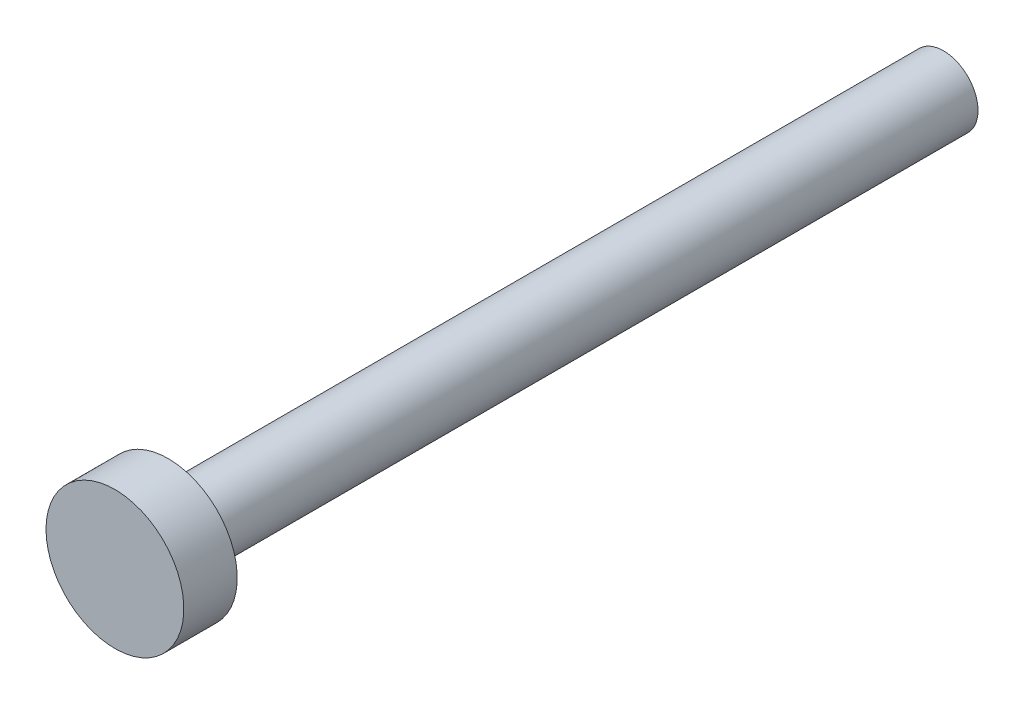
ISO-10303-21;
HEADER;
FILE_DESCRIPTION(('STEP AP214'),'2;1');
FILE_NAME('part.step','',(''),(''),'','','');
FILE_SCHEMA(('AUTOMOTIVE_DESIGN { 1 0 10303 214 1 1 1 1 }'));
ENDSEC;
DATA;
#1=APPLICATION_CONTEXT('core data for automotive mechanical design processes');
#2=APPLICATION_PROTOCOL_DEFINITION('international standard','automotive_design',2000,#1);
#3=PRODUCT_CONTEXT('',#1,'mechanical');
#4=PRODUCT('Part','Part','',(#3));
#5=PRODUCT_RELATED_PRODUCT_CATEGORY('part','',(#4));
#6=PRODUCT_DEFINITION_FORMATION('','',#4);
#7=PRODUCT_DEFINITION_CONTEXT('part definition',#1,'design');
#8=PRODUCT_DEFINITION('design','',#6,#7);
#9=PRODUCT_DEFINITION_SHAPE('','',#8);
#10=(LENGTH_UNIT() NAMED_UNIT(*) SI_UNIT(.MILLI.,.METRE.));
#11=(NAMED_UNIT(*) PLANE_ANGLE_UNIT() SI_UNIT($,.RADIAN.));
#12=(NAMED_UNIT(*) SI_UNIT($,.STERADIAN.) SOLID_ANGLE_UNIT());
#13=UNCERTAINTY_MEASURE_WITH_UNIT(LENGTH_MEASURE(1.E-05),#10,'distance_accuracy_value','');
#14=(GEOMETRIC_REPRESENTATION_CONTEXT(3) GLOBAL_UNCERTAINTY_ASSIGNED_CONTEXT((#13)) GLOBAL_UNIT_ASSIGNED_CONTEXT((#10,
#11,#12)) REPRESENTATION_CONTEXT('',''));
#15=CARTESIAN_POINT('',(0.,0.,0.));
#16=DIRECTION('',(0.,0.,1.));
#17=DIRECTION('',(1.,0.,0.));
#18=AXIS2_PLACEMENT_3D('',#15,#16,#17);
#19=CARTESIAN_POINT('',(0.,0.,3.1));
#20=DIRECTION('',(0.,0.,-1.));
#21=DIRECTION('',(-1.,0.,0.));
#22=AXIS2_PLACEMENT_3D('',#19,#20,#21);
#23=CYLINDRICAL_SURFACE('',#22,4.);
#24=CARTESIAN_POINT('',(0.,0.,3.1));
#25=DIRECTION('',(0.,0.,1.));
#26=DIRECTION('',(1.,0.,0.));
#27=AXIS2_PLACEMENT_3D('',#24,#25,#26);
#28=CIRCLE('',#27,4.);
#29=CARTESIAN_POINT('',(-4.,0.,3.1));
#30=VERTEX_POINT('',#29);
#31=EDGE_CURVE('E40',#30,#30,#28,.T.);
#32=CARTESIAN_POINT('',(0.,0.,0.));
#33=DIRECTION('',(0.,0.,1.));
#34=DIRECTION('',(1.,0.,0.));
#35=AXIS2_PLACEMENT_3D('',#32,#33,#34);
#36=CIRCLE('',#35,4.);
#37=CARTESIAN_POINT('',(-4.,0.,0.));
#38=VERTEX_POINT('',#37);
#39=EDGE_CURVE('E36',#38,#38,#36,.T.);
#40=CARTESIAN_POINT('',(-4.,0.,3.1));
#41=CARTESIAN_POINT('',(-4.,0.,3.06770833333333));
#42=CARTESIAN_POINT('',(-4.,0.,3.03541666666667));
#43=CARTESIAN_POINT('',(-4.,0.,2.97083333333333));
#44=CARTESIAN_POINT('',(-4.,0.,2.93854166666667));
#45=CARTESIAN_POINT('',(-4.,0.,2.87395833333333));
#46=CARTESIAN_POINT('',(-4.,0.,2.84166666666667));
#47=CARTESIAN_POINT('',(-4.,0.,2.77708333333333));
#48=CARTESIAN_POINT('',(-4.,0.,2.74479166666667));
#49=CARTESIAN_POINT('',(-4.,0.,2.68020833333333));
#50=CARTESIAN_POINT('',(-4.,0.,2.64791666666667));
#51=CARTESIAN_POINT('',(-4.,0.,2.58333333333333));
#52=CARTESIAN_POINT('',(-4.,0.,2.55104166666667));
#53=CARTESIAN_POINT('',(-4.,0.,2.48645833333333));
#54=CARTESIAN_POINT('',(-4.,0.,2.45416666666667));
#55=CARTESIAN_POINT('',(-4.,0.,2.38958333333333));
#56=CARTESIAN_POINT('',(-4.,0.,2.35729166666667));
#57=CARTESIAN_POINT('',(-4.,0.,2.29270833333333));
#58=CARTESIAN_POINT('',(-4.,0.,2.26041666666667));
#59=CARTESIAN_POINT('',(-4.,0.,2.19583333333333));
#60=CARTESIAN_POINT('',(-4.,0.,2.16354166666667));
#61=CARTESIAN_POINT('',(-4.,0.,2.09895833333333));
#62=CARTESIAN_POINT('',(-4.,0.,2.06666666666667));
#63=CARTESIAN_POINT('',(-4.,0.,2.00208333333333));
#64=CARTESIAN_POINT('',(-4.,0.,1.96979166666667));
#65=CARTESIAN_POINT('',(-4.,0.,1.90520833333333));
#66=CARTESIAN_POINT('',(-4.,0.,1.87291666666667));
#67=CARTESIAN_POINT('',(-4.,0.,1.80833333333333));
#68=CARTESIAN_POINT('',(-4.,0.,1.77604166666667));
#69=CARTESIAN_POINT('',(-4.,0.,1.71145833333333));
#70=CARTESIAN_POINT('',(-4.,0.,1.67916666666667));
#71=CARTESIAN_POINT('',(-4.,0.,1.61458333333333));
#72=CARTESIAN_POINT('',(-4.,0.,1.58229166666667));
#73=CARTESIAN_POINT('',(-4.,0.,1.51770833333333));
#74=CARTESIAN_POINT('',(-4.,0.,1.48541666666667));
#75=CARTESIAN_POINT('',(-4.,0.,1.42083333333333));
#76=CARTESIAN_POINT('',(-4.,0.,1.38854166666667));
#77=CARTESIAN_POINT('',(-4.,0.,1.32395833333333));
#78=CARTESIAN_POINT('',(-4.,0.,1.29166666666667));
#79=CARTESIAN_POINT('',(-4.,0.,1.22708333333333));
#80=CARTESIAN_POINT('',(-4.,0.,1.19479166666667));
#81=CARTESIAN_POINT('',(-4.,0.,1.13020833333333));
#82=CARTESIAN_POINT('',(-4.,0.,1.09791666666667));
#83=CARTESIAN_POINT('',(-4.,0.,1.03333333333333));
#84=CARTESIAN_POINT('',(-4.,0.,1.00104166666667));
#85=CARTESIAN_POINT('',(-4.,0.,0.936458333333333));
#86=CARTESIAN_POINT('',(-4.,0.,0.904166666666667));
#87=CARTESIAN_POINT('',(-4.,0.,0.839583333333333));
#88=CARTESIAN_POINT('',(-4.,0.,0.807291666666667));
#89=CARTESIAN_POINT('',(-4.,0.,0.742708333333333));
#90=CARTESIAN_POINT('',(-4.,0.,0.710416666666667));
#91=CARTESIAN_POINT('',(-4.,0.,0.645833333333333));
#92=CARTESIAN_POINT('',(-4.,0.,0.613541666666667));
#93=CARTESIAN_POINT('',(-4.,0.,0.548958333333333));
#94=CARTESIAN_POINT('',(-4.,0.,0.516666666666667));
#95=CARTESIAN_POINT('',(-4.,0.,0.452083333333333));
#96=CARTESIAN_POINT('',(-4.,0.,0.419791666666667));
#97=CARTESIAN_POINT('',(-4.,0.,0.355208333333333));
#98=CARTESIAN_POINT('',(-4.,0.,0.322916666666667));
#99=CARTESIAN_POINT('',(-4.,0.,0.258333333333333));
#100=CARTESIAN_POINT('',(-4.,0.,0.226041666666667));
#101=CARTESIAN_POINT('',(-4.,0.,0.161458333333333));
#102=CARTESIAN_POINT('',(-4.,0.,0.129166666666667));
#103=CARTESIAN_POINT('',(-4.,0.,0.0645833333333335));
#104=CARTESIAN_POINT('',(-4.,0.,0.0322916666666667));
#105=CARTESIAN_POINT('',(-4.,0.,0.));
#106=B_SPLINE_CURVE_WITH_KNOTS('',3,(#40,#41,#42,#43,#44,#45,#46,#47,#48,#49,#50,#51,#52,#53,
#54,#55,#56,#57,#58,#59,#60,#61,#62,#63,#64,#65,#66,#67,#68,#69,#70,#71,#72,#73,#74,#75,#76,#77,
#78,#79,#80,#81,#82,#83,#84,#85,#86,#87,#88,#89,#90,#91,#92,#93,#94,#95,#96,#97,#98,#99,#100,
#101,#102,#103,#104,#105),.UNSPECIFIED.,.F.,.F.,(4,2,2,2,2,2,2,2,2,2,2,2,2,2,2,2,2,2,2,2,2,2,2,
2,2,2,2,2,2,2,2,2,4),(0.,0.0968749999999997,0.19375,0.290625,0.3875,0.484375,0.58125,0.678125,
0.775,0.871874999999999,0.96875,1.065625,1.1625,1.259375,1.35625,1.453125,1.55,1.646875,1.74375,
1.840625,1.9375,2.034375,2.13125,2.228125,2.325,2.421875,2.51875,2.615625,2.7125,2.809375,
2.90625,3.003125,3.1),.UNSPECIFIED.);
#107=EDGE_CURVE('BSEAM33',#30,#38,#106,.T.);
#108=ORIENTED_EDGE('',*,*,#31,.F.);
#109=ORIENTED_EDGE('',*,*,#39,.T.);
#110=ORIENTED_EDGE('',*,*,#107,.T.);
#111=ORIENTED_EDGE('',*,*,#107,.F.);
#112=EDGE_LOOP('',(#108,#110,#109,#111));
#113=FACE_BOUND('',#112,.T.);
#114=ADVANCED_FACE('F33',(#113),#23,.T.);
#115=CARTESIAN_POINT('',(0.,0.,3.1));
#116=DIRECTION('',(0.,0.,1.));
#117=DIRECTION('',(1.,0.,0.));
#118=AXIS2_PLACEMENT_3D('',#115,#116,#117);
#119=PLANE('',#118);
#120=ORIENTED_EDGE('',*,*,#31,.T.);
#121=EDGE_LOOP('',(#120));
#122=FACE_BOUND('',#121,.T.);
#123=ADVANCED_FACE('F57',(#122),#119,.T.);
#124=CARTESIAN_POINT('',(0.,0.,0.));
#125=DIRECTION('',(0.,0.,1.));
#126=DIRECTION('',(1.,0.,0.));
#127=AXIS2_PLACEMENT_3D('',#124,#125,#126);
#128=PLANE('',#127);
#129=CARTESIAN_POINT('',(0.,0.,0.));
#130=DIRECTION('',(0.,0.,-1.));
#131=DIRECTION('',(-1.,0.,0.));
#132=AXIS2_PLACEMENT_3D('',#129,#130,#131);
#133=CIRCLE('',#132,2.);
#134=CARTESIAN_POINT('',(2.,0.,0.));
#135=VERTEX_POINT('',#134);
#136=EDGE_CURVE('E10',#135,#135,#133,.T.);
#137=ORIENTED_EDGE('',*,*,#136,.F.);
#138=EDGE_LOOP('',(#137));
#139=FACE_BOUND('',#138,.T.);
#140=ORIENTED_EDGE('',*,*,#39,.F.);
#141=EDGE_LOOP('',(#140));
#142=FACE_BOUND('',#141,.T.);
#143=ADVANCED_FACE('F54',(#139,#142),#128,.F.);
#144=CARTESIAN_POINT('',(0.,0.,-45.));
#145=DIRECTION('',(0.,0.,1.));
#146=DIRECTION('',(1.,0.,0.));
#147=AXIS2_PLACEMENT_3D('',#144,#145,#146);
#148=CYLINDRICAL_SURFACE('',#147,2.);
#149=CARTESIAN_POINT('',(0.,0.,-45.));
#150=DIRECTION('',(0.,0.,-1.));
#151=DIRECTION('',(-1.,0.,0.));
#152=AXIS2_PLACEMENT_3D('',#149,#150,#151);
#153=CIRCLE('',#152,2.);
#154=CARTESIAN_POINT('',(2.,0.,-45.));
#155=VERTEX_POINT('',#154);
#156=EDGE_CURVE('E46',#155,#155,#153,.T.);
#157=CARTESIAN_POINT('',(2.,0.,-45.));
#158=CARTESIAN_POINT('',(2.,0.,-44.53125));
#159=CARTESIAN_POINT('',(2.,0.,-44.0625));
#160=CARTESIAN_POINT('',(2.,0.,-43.125));
#161=CARTESIAN_POINT('',(2.,0.,-42.65625));
#162=CARTESIAN_POINT('',(2.,0.,-41.71875));
#163=CARTESIAN_POINT('',(2.,0.,-41.25));
#164=CARTESIAN_POINT('',(2.,0.,-40.3125));
#165=CARTESIAN_POINT('',(2.,0.,-39.84375));
#166=CARTESIAN_POINT('',(2.,0.,-38.90625));
#167=CARTESIAN_POINT('',(2.,0.,-38.4375));
#168=CARTESIAN_POINT('',(2.,0.,-37.5));
#169=CARTESIAN_POINT('',(2.,0.,-37.03125));
#170=CARTESIAN_POINT('',(2.,0.,-36.09375));
#171=CARTESIAN_POINT('',(2.,0.,-35.625));
#172=CARTESIAN_POINT('',(2.,0.,-34.6875));
#173=CARTESIAN_POINT('',(2.,0.,-34.21875));
#174=CARTESIAN_POINT('',(2.,0.,-33.28125));
#175=CARTESIAN_POINT('',(2.,0.,-32.8125));
#176=CARTESIAN_POINT('',(2.,0.,-31.875));
#177=CARTESIAN_POINT('',(2.,0.,-31.40625));
#178=CARTESIAN_POINT('',(2.,0.,-30.46875));
#179=CARTESIAN_POINT('',(2.,0.,-30.));
#180=CARTESIAN_POINT('',(2.,0.,-29.0625));
#181=CARTESIAN_POINT('',(2.,0.,-28.59375));
#182=CARTESIAN_POINT('',(2.,0.,-27.65625));
#183=CARTESIAN_POINT('',(2.,0.,-27.1875));
#184=CARTESIAN_POINT('',(2.,0.,-26.25));
#185=CARTESIAN_POINT('',(2.,0.,-25.78125));
#186=CARTESIAN_POINT('',(2.,0.,-24.84375));
#187=CARTESIAN_POINT('',(2.,0.,-24.375));
#188=CARTESIAN_POINT('',(2.,0.,-23.4375));
#189=CARTESIAN_POINT('',(2.,0.,-22.96875));
#190=CARTESIAN_POINT('',(2.,0.,-22.03125));
#191=CARTESIAN_POINT('',(2.,0.,-21.5625));
#192=CARTESIAN_POINT('',(2.,0.,-20.625));
#193=CARTESIAN_POINT('',(2.,0.,-20.15625));
#194=CARTESIAN_POINT('',(2.,0.,-19.21875));
#195=CARTESIAN_POINT('',(2.,0.,-18.75));
#196=CARTESIAN_POINT('',(2.,0.,-17.8125));
#197=CARTESIAN_POINT('',(2.,0.,-17.34375));
#198=CARTESIAN_POINT('',(2.,0.,-16.40625));
#199=CARTESIAN_POINT('',(2.,0.,-15.9375));
#200=CARTESIAN_POINT('',(2.,0.,-15.));
#201=CARTESIAN_POINT('',(2.,0.,-14.53125));
#202=CARTESIAN_POINT('',(2.,0.,-13.59375));
#203=CARTESIAN_POINT('',(2.,0.,-13.125));
#204=CARTESIAN_POINT('',(2.,0.,-12.1875));
#205=CARTESIAN_POINT('',(2.,0.,-11.71875));
#206=CARTESIAN_POINT('',(2.,0.,-10.78125));
#207=CARTESIAN_POINT('',(2.,0.,-10.3125));
#208=CARTESIAN_POINT('',(2.,0.,-9.37499999999999));
#209=CARTESIAN_POINT('',(2.,0.,-8.90624999999999));
#210=CARTESIAN_POINT('',(2.,0.,-7.96874999999999));
#211=CARTESIAN_POINT('',(2.,0.,-7.5));
#212=CARTESIAN_POINT('',(2.,0.,-6.56249999999999));
#213=CARTESIAN_POINT('',(2.,0.,-6.09374999999999));
#214=CARTESIAN_POINT('',(2.,0.,-5.15624999999999));
#215=CARTESIAN_POINT('',(2.,0.,-4.68749999999999));
#216=CARTESIAN_POINT('',(2.,0.,-3.74999999999999));
#217=CARTESIAN_POINT('',(2.,0.,-3.28124999999999));
#218=CARTESIAN_POINT('',(2.,0.,-2.34374999999999));
#219=CARTESIAN_POINT('',(2.,0.,-1.87499999999999));
#220=CARTESIAN_POINT('',(2.,0.,-0.937499999999992));
#221=CARTESIAN_POINT('',(2.,0.,-0.468749999999993));
#222=CARTESIAN_POINT('',(2.,0.,0.));
#223=B_SPLINE_CURVE_WITH_KNOTS('',3,(#157,#158,#159,#160,#161,#162,#163,#164,#165,#166,#167,
#168,#169,#170,#171,#172,#173,#174,#175,#176,#177,#178,#179,#180,#181,#182,#183,#184,#185,#186,
#187,#188,#189,#190,#191,#192,#193,#194,#195,#196,#197,#198,#199,#200,#201,#202,#203,#204,#205,
#206,#207,#208,#209,#210,#211,#212,#213,#214,#215,#216,#217,#218,#219,#220,#221,#222),
.UNSPECIFIED.,.F.,.F.,(4,2,2,2,2,2,2,2,2,2,2,2,2,2,2,2,2,2,2,2,2,2,2,2,2,2,2,2,2,2,2,2,4),(0.,
1.40625,2.8125,4.21874999999999,5.625,7.03125,8.43749999999999,9.84375,11.25,12.65625,14.0625,
15.46875,16.875,18.28125,19.6875,21.09375,22.5,23.90625,25.3125,26.71875,28.125,29.53125,
30.9375,32.34375,33.75,35.15625,36.5625,37.96875,39.375,40.78125,42.1875,43.59375,45.),.UNSPECIFIED.);
#224=EDGE_CURVE('BSEAM56',#155,#135,#223,.T.);
#225=ORIENTED_EDGE('',*,*,#156,.F.);
#226=ORIENTED_EDGE('',*,*,#136,.T.);
#227=ORIENTED_EDGE('',*,*,#224,.T.);
#228=ORIENTED_EDGE('',*,*,#224,.F.);
#229=EDGE_LOOP('',(#225,#227,#226,#228));
#230=FACE_BOUND('',#229,.T.);
#231=ADVANCED_FACE('F56',(#230),#148,.T.);
#232=CARTESIAN_POINT('',(0.,0.,-45.));
#233=DIRECTION('',(0.,0.,-1.));
#234=DIRECTION('',(-1.,0.,0.));
#235=AXIS2_PLACEMENT_3D('',#232,#233,#234);
#236=PLANE('',#235);
#237=ORIENTED_EDGE('',*,*,#156,.T.);
#238=EDGE_LOOP('',(#237));
#239=FACE_BOUND('',#238,.T.);
#240=ADVANCED_FACE('F63',(#239),#236,.T.);
#241=CLOSED_SHELL('',(#114,#123,#143,#231,#240));
#242=MANIFOLD_SOLID_BREP('B2',#241);
#243=ADVANCED_BREP_SHAPE_REPRESENTATION('',(#18,#242),#14);
#244=SHAPE_DEFINITION_REPRESENTATION(#9,#243);
ENDSEC;
END-ISO-10303-21;
